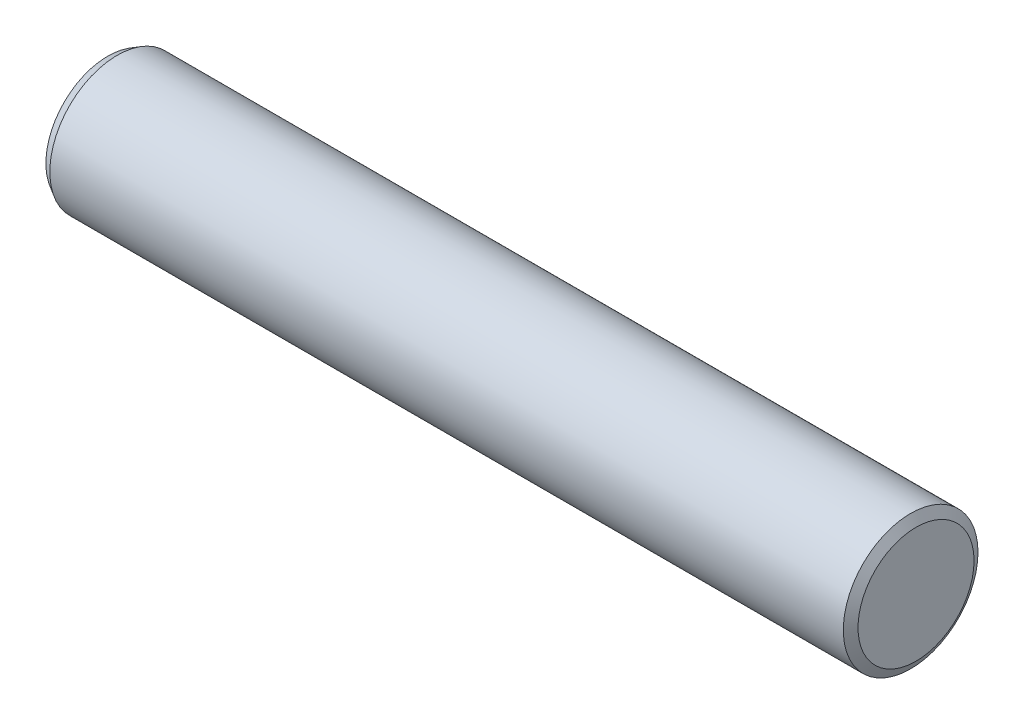
ISO-10303-21;
HEADER;
FILE_DESCRIPTION(('STEP AP214'),'2;1');
FILE_NAME('part.step','',(''),(''),'','','');
FILE_SCHEMA(('AUTOMOTIVE_DESIGN { 1 0 10303 214 1 1 1 1 }'));
ENDSEC;
DATA;
#1=APPLICATION_CONTEXT('core data for automotive mechanical design processes');
#2=APPLICATION_PROTOCOL_DEFINITION('international standard','automotive_design',2000,#1);
#3=PRODUCT_CONTEXT('',#1,'mechanical');
#4=PRODUCT('Part','Part','',(#3));
#5=PRODUCT_RELATED_PRODUCT_CATEGORY('part','',(#4));
#6=PRODUCT_DEFINITION_FORMATION('','',#4);
#7=PRODUCT_DEFINITION_CONTEXT('part definition',#1,'design');
#8=PRODUCT_DEFINITION('design','',#6,#7);
#9=PRODUCT_DEFINITION_SHAPE('','',#8);
#10=(LENGTH_UNIT() NAMED_UNIT(*) SI_UNIT(.MILLI.,.METRE.));
#11=(NAMED_UNIT(*) PLANE_ANGLE_UNIT() SI_UNIT($,.RADIAN.));
#12=(NAMED_UNIT(*) SI_UNIT($,.STERADIAN.) SOLID_ANGLE_UNIT());
#13=UNCERTAINTY_MEASURE_WITH_UNIT(LENGTH_MEASURE(1.E-05),#10,'distance_accuracy_value','');
#14=(GEOMETRIC_REPRESENTATION_CONTEXT(3) GLOBAL_UNCERTAINTY_ASSIGNED_CONTEXT((#13)) GLOBAL_UNIT_ASSIGNED_CONTEXT((#10,
#11,#12)) REPRESENTATION_CONTEXT('',''));
#15=CARTESIAN_POINT('',(0.,0.,0.));
#16=DIRECTION('',(0.,0.,1.));
#17=DIRECTION('',(1.,0.,0.));
#18=AXIS2_PLACEMENT_3D('',#15,#16,#17);
#19=CARTESIAN_POINT('',(0.,0.,0.));
#20=DIRECTION('',(1.,0.,0.));
#21=DIRECTION('',(0.,0.,-1.));
#22=AXIS2_PLACEMENT_3D('',#19,#20,#21);
#23=PLANE('',#22);
#24=CARTESIAN_POINT('',(0.,0.,0.));
#25=DIRECTION('',(1.,0.,0.));
#26=DIRECTION('',(0.,0.,-1.));
#27=AXIS2_PLACEMENT_3D('',#24,#25,#26);
#28=CIRCLE('',#27,2.15358983848622);
#29=CARTESIAN_POINT('',(0.,0.,-2.15358983848622));
#30=VERTEX_POINT('',#29);
#31=EDGE_CURVE('E56',#30,#30,#28,.T.);
#32=ORIENTED_EDGE('',*,*,#31,.T.);
#33=EDGE_LOOP('',(#32));
#34=FACE_BOUND('',#33,.T.);
#35=ADVANCED_FACE('F40',(#34),#23,.T.);
#36=CARTESIAN_POINT('',(0.,0.,0.));
#37=DIRECTION('',(1.,0.,0.));
#38=DIRECTION('',(0.,0.,-1.));
#39=AXIS2_PLACEMENT_3D('',#36,#37,#38);
#40=CYLINDRICAL_SURFACE('',#39,2.5);
#41=CARTESIAN_POINT('',(-0.200000000000004,0.,0.));
#42=DIRECTION('',(1.,0.,0.));
#43=DIRECTION('',(0.,0.,-1.));
#44=AXIS2_PLACEMENT_3D('',#41,#42,#43);
#45=CIRCLE('',#44,2.5);
#46=CARTESIAN_POINT('',(-0.200000000000004,0.,-2.5));
#47=VERTEX_POINT('',#46);
#48=EDGE_CURVE('E48',#47,#47,#45,.F.);
#49=ORIENTED_EDGE('',*,*,#48,.T.);
#50=EDGE_LOOP('',(#49));
#51=FACE_BOUND('',#50,.T.);
#52=CARTESIAN_POINT('',(-29.6535898384862,0.,0.));
#53=DIRECTION('',(-1.,0.,0.));
#54=DIRECTION('',(0.,0.,1.));
#55=AXIS2_PLACEMENT_3D('',#52,#53,#54);
#56=CIRCLE('',#55,2.5);
#57=CARTESIAN_POINT('',(-29.6535898384862,0.,-2.5));
#58=VERTEX_POINT('',#57);
#59=EDGE_CURVE('E52',#58,#58,#56,.F.);
#60=ORIENTED_EDGE('',*,*,#59,.T.);
#61=EDGE_LOOP('',(#60));
#62=FACE_BOUND('',#61,.T.);
#63=ADVANCED_FACE('F72',(#51,#62),#40,.T.);
#64=CARTESIAN_POINT('',(-30.,0.,0.));
#65=DIRECTION('',(-1.,0.,0.));
#66=DIRECTION('',(0.,0.,1.));
#67=AXIS2_PLACEMENT_3D('',#64,#65,#66);
#68=PLANE('',#67);
#69=CARTESIAN_POINT('',(-30.,0.,0.));
#70=DIRECTION('',(-1.,0.,0.));
#71=DIRECTION('',(0.,0.,1.));
#72=AXIS2_PLACEMENT_3D('',#69,#70,#71);
#73=CIRCLE('',#72,2.29999999999999);
#74=CARTESIAN_POINT('',(-30.,0.,-2.29999999999999));
#75=VERTEX_POINT('',#74);
#76=EDGE_CURVE('E10',#75,#75,#73,.T.);
#77=ORIENTED_EDGE('',*,*,#76,.T.);
#78=EDGE_LOOP('',(#77));
#79=FACE_BOUND('',#78,.T.);
#80=ADVANCED_FACE('F65',(#79),#68,.T.);
#81=CARTESIAN_POINT('',(0.,0.,0.));
#82=DIRECTION('',(-1.,0.,0.));
#83=DIRECTION('',(0.,0.,1.));
#84=AXIS2_PLACEMENT_3D('',#81,#82,#83);
#85=CONICAL_SURFACE('',#84,2.15358983848622,1.0471975511966);
#86=ORIENTED_EDGE('',*,*,#48,.F.);
#87=EDGE_LOOP('',(#86));
#88=FACE_BOUND('',#87,.T.);
#89=ORIENTED_EDGE('',*,*,#31,.F.);
#90=EDGE_LOOP('',(#89));
#91=FACE_BOUND('',#90,.T.);
#92=ADVANCED_FACE('F63',(#88,#91),#85,.T.);
#93=CARTESIAN_POINT('',(-29.6535898384862,0.,0.));
#94=DIRECTION('',(1.,0.,0.));
#95=DIRECTION('',(0.,0.,-1.));
#96=AXIS2_PLACEMENT_3D('',#93,#94,#95);
#97=CONICAL_SURFACE('',#96,2.5,0.5235987755983);
#98=CARTESIAN_POINT('',(-30.,0.,-2.29999999999999));
#99=CARTESIAN_POINT('',(-29.9963915608176,0.,-2.30208333333333));
#100=CARTESIAN_POINT('',(-29.9927831216351,0.,-2.30416666666666));
#101=CARTESIAN_POINT('',(-29.9855662432703,0.,-2.30833333333333));
#102=CARTESIAN_POINT('',(-29.9819578040878,0.,-2.31041666666666));
#103=CARTESIAN_POINT('',(-29.9747409257229,0.,-2.31458333333333));
#104=CARTESIAN_POINT('',(-29.9711324865405,0.,-2.31666666666666));
#105=CARTESIAN_POINT('',(-29.9639156081756,0.,-2.32083333333333));
#106=CARTESIAN_POINT('',(-29.9603071689932,0.,-2.32291666666666));
#107=CARTESIAN_POINT('',(-29.9530902906283,0.,-2.32708333333333));
#108=CARTESIAN_POINT('',(-29.9494818514459,0.,-2.32916666666666));
#109=CARTESIAN_POINT('',(-29.942264973081,0.,-2.33333333333333));
#110=CARTESIAN_POINT('',(-29.9386565338986,0.,-2.33541666666666));
#111=CARTESIAN_POINT('',(-29.9314396555337,0.,-2.33958333333333));
#112=CARTESIAN_POINT('',(-29.9278312163513,0.,-2.34166666666666));
#113=CARTESIAN_POINT('',(-29.9206143379864,0.,-2.34583333333333));
#114=CARTESIAN_POINT('',(-29.917005898804,0.,-2.34791666666666));
#115=CARTESIAN_POINT('',(-29.9097890204391,0.,-2.35208333333333));
#116=CARTESIAN_POINT('',(-29.9061805812567,0.,-2.35416666666666));
#117=CARTESIAN_POINT('',(-29.8989637028918,0.,-2.35833333333333));
#118=CARTESIAN_POINT('',(-29.8953552637094,0.,-2.36041666666666));
#119=CARTESIAN_POINT('',(-29.8881383853445,0.,-2.36458333333333));
#120=CARTESIAN_POINT('',(-29.8845299461621,0.,-2.36666666666666));
#121=CARTESIAN_POINT('',(-29.8773130677972,0.,-2.37083333333333));
#122=CARTESIAN_POINT('',(-29.8737046286148,0.,-2.37291666666666));
#123=CARTESIAN_POINT('',(-29.8664877502499,0.,-2.37708333333333));
#124=CARTESIAN_POINT('',(-29.8628793110675,0.,-2.37916666666666));
#125=CARTESIAN_POINT('',(-29.8556624327026,0.,-2.38333333333333));
#126=CARTESIAN_POINT('',(-29.8520539935202,0.,-2.38541666666666));
#127=CARTESIAN_POINT('',(-29.8448371151553,0.,-2.38958333333333));
#128=CARTESIAN_POINT('',(-29.8412286759728,0.,-2.39166666666666));
#129=CARTESIAN_POINT('',(-29.834011797608,0.,-2.39583333333333));
#130=CARTESIAN_POINT('',(-29.8304033584255,0.,-2.39791666666666));
#131=CARTESIAN_POINT('',(-29.8231864800607,0.,-2.40208333333333));
#132=CARTESIAN_POINT('',(-29.8195780408782,0.,-2.40416666666666));
#133=CARTESIAN_POINT('',(-29.8123611625134,0.,-2.40833333333333));
#134=CARTESIAN_POINT('',(-29.8087527233309,0.,-2.41041666666666));
#135=CARTESIAN_POINT('',(-29.8015358449661,0.,-2.41458333333333));
#136=CARTESIAN_POINT('',(-29.7979274057836,0.,-2.41666666666666));
#137=CARTESIAN_POINT('',(-29.7907105274187,0.,-2.42083333333333));
#138=CARTESIAN_POINT('',(-29.7871020882363,0.,-2.42291666666666));
#139=CARTESIAN_POINT('',(-29.7798852098714,0.,-2.42708333333333));
#140=CARTESIAN_POINT('',(-29.776276770689,0.,-2.42916666666666));
#141=CARTESIAN_POINT('',(-29.7690598923241,0.,-2.43333333333333));
#142=CARTESIAN_POINT('',(-29.7654514531417,0.,-2.43541666666666));
#143=CARTESIAN_POINT('',(-29.7582345747768,0.,-2.43958333333333));
#144=CARTESIAN_POINT('',(-29.7546261355944,0.,-2.44166666666666));
#145=CARTESIAN_POINT('',(-29.7474092572295,0.,-2.44583333333333));
#146=CARTESIAN_POINT('',(-29.7438008180471,0.,-2.44791666666666));
#147=CARTESIAN_POINT('',(-29.7365839396822,0.,-2.45208333333333));
#148=CARTESIAN_POINT('',(-29.7329755004998,0.,-2.45416666666666));
#149=CARTESIAN_POINT('',(-29.7257586221349,0.,-2.45833333333333));
#150=CARTESIAN_POINT('',(-29.7221501829525,0.,-2.46041666666666));
#151=CARTESIAN_POINT('',(-29.7149333045876,0.,-2.46458333333333));
#152=CARTESIAN_POINT('',(-29.7113248654052,0.,-2.46666666666667));
#153=CARTESIAN_POINT('',(-29.7041079870403,0.,-2.47083333333333));
#154=CARTESIAN_POINT('',(-29.7004995478579,0.,-2.47291666666667));
#155=CARTESIAN_POINT('',(-29.693282669493,0.,-2.47708333333333));
#156=CARTESIAN_POINT('',(-29.6896742303106,0.,-2.47916666666667));
#157=CARTESIAN_POINT('',(-29.6824573519457,0.,-2.48333333333333));
#158=CARTESIAN_POINT('',(-29.6788489127633,0.,-2.48541666666667));
#159=CARTESIAN_POINT('',(-29.6716320343984,0.,-2.48958333333333));
#160=CARTESIAN_POINT('',(-29.668023595216,0.,-2.49166666666667));
#161=CARTESIAN_POINT('',(-29.6608067168511,0.,-2.49583333333333));
#162=CARTESIAN_POINT('',(-29.6571982776686,0.,-2.49791666666667));
#163=CARTESIAN_POINT('',(-29.6535898384862,0.,-2.5));
#164=B_SPLINE_CURVE_WITH_KNOTS('',3,(#98,#99,#100,#101,#102,#103,#104,#105,#106,#107,#108,#109,
#110,#111,#112,#113,#114,#115,#116,#117,#118,#119,#120,#121,#122,#123,#124,#125,#126,#127,#128,
#129,#130,#131,#132,#133,#134,#135,#136,#137,#138,#139,#140,#141,#142,#143,#144,#145,#146,#147,
#148,#149,#150,#151,#152,#153,#154,#155,#156,#157,#158,#159,#160,#161,#162,#163),.UNSPECIFIED.,
.F.,.F.,(4,2,2,2,2,2,2,2,2,2,2,2,2,2,2,2,2,2,2,2,2,2,2,2,2,2,2,2,2,2,2,2,4),(0.,
0.0124999999999983,0.0249999999999997,0.037500000000001,0.0499999999999996,0.0625000000000009,
0.0750000000000022,0.0875000000000005,0.100000000000002,0.112500000000003,0.125000000000002,
0.137500000000003,0.150000000000004,0.162500000000003,0.175000000000004,0.187500000000005,
0.200000000000007,0.212500000000005,0.225000000000006,0.237500000000008,0.250000000000006,
0.262500000000007,0.275000000000009,0.287500000000007,0.300000000000009,0.31250000000001,
0.325000000000008,0.33750000000001,0.350000000000011,0.362500000000009,0.375000000000011,
0.387500000000012,0.40000000000001),.UNSPECIFIED.);
#165=EDGE_CURVE('BSEAM43',#75,#58,#164,.T.);
#166=ORIENTED_EDGE('',*,*,#76,.F.);
#167=ORIENTED_EDGE('',*,*,#59,.F.);
#168=ORIENTED_EDGE('',*,*,#165,.T.);
#169=ORIENTED_EDGE('',*,*,#165,.F.);
#170=EDGE_LOOP('',(#166,#168,#167,#169));
#171=FACE_BOUND('',#170,.T.);
#172=ADVANCED_FACE('F43',(#171),#97,.T.);
#173=CLOSED_SHELL('',(#35,#63,#80,#92,#172));
#174=MANIFOLD_SOLID_BREP('B2',#173);
#175=ADVANCED_BREP_SHAPE_REPRESENTATION('',(#18,#174),#14);
#176=SHAPE_DEFINITION_REPRESENTATION(#9,#175);
ENDSEC;
END-ISO-10303-21;
